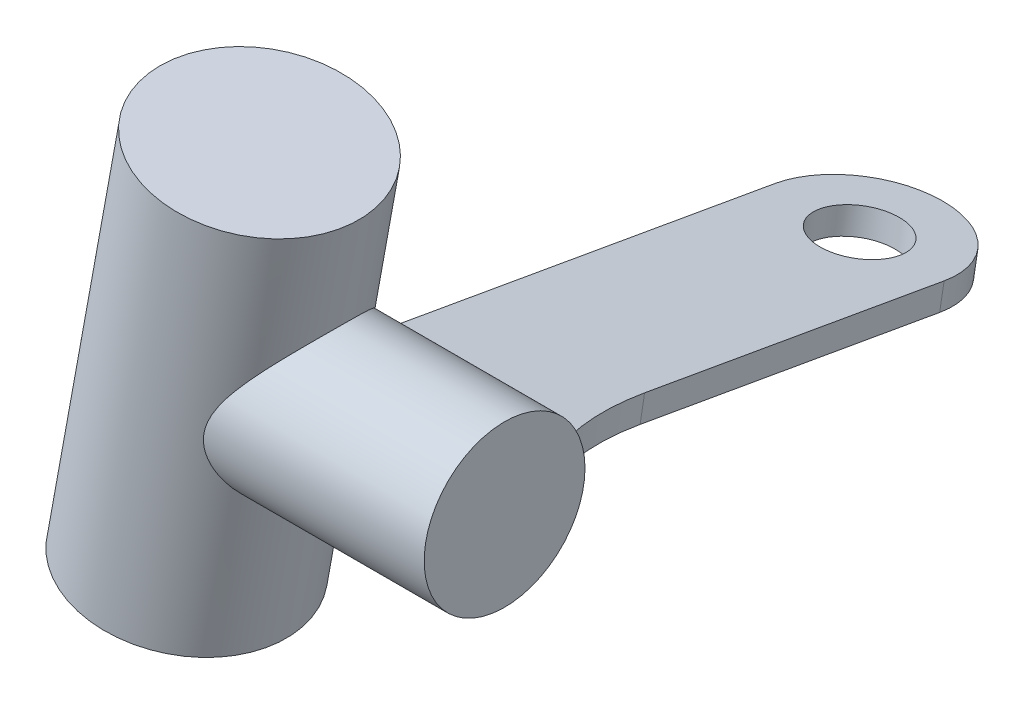
ISO-10303-21;
HEADER;
FILE_DESCRIPTION(('STEP AP214'),'2;1');
FILE_NAME('part.step','',(''),(''),'','','');
FILE_SCHEMA(('AUTOMOTIVE_DESIGN { 1 0 10303 214 1 1 1 1 }'));
ENDSEC;
DATA;
#1=APPLICATION_CONTEXT('core data for automotive mechanical design processes');
#2=APPLICATION_PROTOCOL_DEFINITION('international standard','automotive_design',2000,#1);
#3=PRODUCT_CONTEXT('',#1,'mechanical');
#4=PRODUCT('Part','Part','',(#3));
#5=PRODUCT_RELATED_PRODUCT_CATEGORY('part','',(#4));
#6=PRODUCT_DEFINITION_FORMATION('','',#4);
#7=PRODUCT_DEFINITION_CONTEXT('part definition',#1,'design');
#8=PRODUCT_DEFINITION('design','',#6,#7);
#9=PRODUCT_DEFINITION_SHAPE('','',#8);
#10=(LENGTH_UNIT() NAMED_UNIT(*) SI_UNIT(.MILLI.,.METRE.));
#11=(NAMED_UNIT(*) PLANE_ANGLE_UNIT() SI_UNIT($,.RADIAN.));
#12=(NAMED_UNIT(*) SI_UNIT($,.STERADIAN.) SOLID_ANGLE_UNIT());
#13=UNCERTAINTY_MEASURE_WITH_UNIT(LENGTH_MEASURE(1.E-05),#10,'distance_accuracy_value','');
#14=(GEOMETRIC_REPRESENTATION_CONTEXT(3) GLOBAL_UNCERTAINTY_ASSIGNED_CONTEXT((#13)) GLOBAL_UNIT_ASSIGNED_CONTEXT((#10,
#11,#12)) REPRESENTATION_CONTEXT('',''));
#15=CARTESIAN_POINT('',(0.,0.,0.));
#16=DIRECTION('',(0.,0.,1.));
#17=DIRECTION('',(1.,0.,0.));
#18=AXIS2_PLACEMENT_3D('',#15,#16,#17);
#19=CARTESIAN_POINT('',(-15.,-12.8616465689199,-25.4520253263644));
#20=DIRECTION('',(0.,0.866025403784442,-0.499999999999994));
#21=DIRECTION('',(0.,0.499999999999994,0.866025403784442));
#22=AXIS2_PLACEMENT_3D('',#19,#20,#21);
#23=PLANE('',#22);
#24=CARTESIAN_POINT('',(39.7221129530484,-18.7645988885125,-35.6762386585556));
#25=DIRECTION('',(0.,0.866025403784442,-0.499999999999994));
#26=DIRECTION('',(0.,0.499999999999994,0.866025403784442));
#27=AXIS2_PLACEMENT_3D('',#24,#25,#26);
#28=ELLIPSE('',#27,35.8863230455562,33.7221129530484);
#29=CARTESIAN_POINT('',(8.06525641866222,-12.5817274870452,-24.9671912545494));
#30=VERTEX_POINT('',#29);
#31=CARTESIAN_POINT('',(10.4943666920415,-9.81474755847106,-20.1746414347357));
#32=VERTEX_POINT('',#31);
#33=EDGE_CURVE('E51',#30,#32,#28,.T.);
#34=ORIENTED_EDGE('',*,*,#33,.F.);
#35=DIRECTION('',(1.,0.,0.));
#36=VECTOR('',#35,1.);
#37=CARTESIAN_POINT('',(-15.,-12.5817274870452,-24.9671912545494));
#38=LINE('',#37,#36);
#39=CARTESIAN_POINT('',(-15.,-12.5817274870452,-24.9671912545495));
#40=VERTEX_POINT('',#39);
#41=EDGE_CURVE('E351',#40,#30,#38,.T.);
#42=ORIENTED_EDGE('',*,*,#41,.F.);
#43=DIRECTION('',(0.,0.499999999999994,0.866025403784442));
#44=VECTOR('',#43,1.);
#45=CARTESIAN_POINT('',(-15.,-12.8616465689199,-25.4520253263644));
#46=LINE('',#45,#44);
#47=CARTESIAN_POINT('',(-15.,-4.96881481459879,-11.7812397122871));
#48=VERTEX_POINT('',#47);
#49=EDGE_CURVE('E146',#40,#48,#46,.T.);
#50=ORIENTED_EDGE('',*,*,#49,.T.);
#51=CARTESIAN_POINT('',(-9.67810962203151,1.8254835432095,-0.0131697547811885));
#52=DIRECTION('',(0.,0.866025403784442,-0.499999999999994));
#53=DIRECTION('',(-0.336322043603112,-0.470873518842004,-0.815576858573105));
#54=AXIS2_PLACEMENT_3D('',#51,#52,#53);
#55=ELLIPSE('',#54,14.5960063578834,12.5);
#56=CARTESIAN_POINT('',(-2.21444101385907,-3.56177873394936,-9.34418173252139));
#57=VERTEX_POINT('',#56);
#58=EDGE_CURVE('E144',#57,#48,#55,.T.);
#59=ORIENTED_EDGE('',*,*,#58,.F.);
#60=DIRECTION('',(1.,0.,0.));
#61=VECTOR('',#60,1.);
#62=CARTESIAN_POINT('',(-10.,-3.56177873395016,-9.34418173252106));
#63=LINE('',#62,#61);
#64=CARTESIAN_POINT('',(15.,-3.56177873395016,-9.34418173252107));
#65=VERTEX_POINT('',#64);
#66=EDGE_CURVE('E364',#57,#65,#63,.T.);
#67=ORIENTED_EDGE('',*,*,#66,.T.);
#68=DIRECTION('',(0.,0.499999999999994,0.866025403784442));
#69=VECTOR('',#68,1.);
#70=CARTESIAN_POINT('',(15.,-12.8616465689199,-25.4520253263644));
#71=LINE('',#70,#69);
#72=CARTESIAN_POINT('',(15.,-3.62518467149175,-9.45400403784463));
#73=VERTEX_POINT('',#72);
#74=EDGE_CURVE('E134',#73,#65,#71,.T.);
#75=ORIENTED_EDGE('',*,*,#74,.F.);
#76=DIRECTION('',(0.342020143325663,0.46984631039295,0.813797681349379));
#77=VECTOR('',#76,1.);
#78=CARTESIAN_POINT('',(15.,-3.62518467149175,-9.45400403784463));
#79=LINE('',#78,#77);
#80=EDGE_CURVE('E135',#32,#73,#79,.T.);
#81=ORIENTED_EDGE('',*,*,#80,.F.);
#82=EDGE_LOOP('',(#34,#42,#50,#59,#67,#75,#81));
#83=FACE_BOUND('',#82,.T.);
#84=ADVANCED_FACE('F34',(#83),#23,.T.);
#85=CARTESIAN_POINT('',(15.,0.,0.));
#86=DIRECTION('',(1.,0.,0.));
#87=DIRECTION('',(0.,0.,-1.));
#88=AXIS2_PLACEMENT_3D('',#85,#86,#87);
#89=PLANE('',#88);
#90=DIRECTION('',(0.,-0.866025403784442,0.499999999999994));
#91=VECTOR('',#90,1.);
#92=CARTESIAN_POINT('',(15.,-4.99999999999995,-8.66025403784442));
#93=LINE('',#92,#91);
#94=CARTESIAN_POINT('',(15.,-4.99999999999994,-8.66025403784442));
#95=VERTEX_POINT('',#94);
#96=EDGE_CURVE('E11',#73,#95,#93,.T.);
#97=ORIENTED_EDGE('',*,*,#96,.F.);
#98=ORIENTED_EDGE('',*,*,#74,.T.);
#99=CARTESIAN_POINT('',(15.,0.,0.));
#100=DIRECTION('',(1.,0.,0.));
#101=DIRECTION('',(0.,0.,-1.));
#102=AXIS2_PLACEMENT_3D('',#99,#100,#101);
#103=CIRCLE('',#102,10.);
#104=EDGE_CURVE('E168',#65,#95,#103,.F.);
#105=ORIENTED_EDGE('',*,*,#104,.T.);
#106=EDGE_LOOP('',(#97,#98,#105));
#107=FACE_BOUND('',#106,.T.);
#108=ADVANCED_FACE('F175',(#107),#89,.T.);
#109=CARTESIAN_POINT('',(-5.65879555832661,24.6195531410487,-0.177615119509685));
#110=DIRECTION('',(-0.173648177666927,-0.984782125641946,0.00710460478038752));
#111=DIRECTION('',(0.984806980223185,-0.173652560314242,0.));
#112=AXIS2_PLACEMENT_3D('',#109,#110,#111);
#113=CYLINDRICAL_SURFACE('',#112,12.5);
#114=CARTESIAN_POINT('',(-2.37122751207205,0.,-10.));
#115=CARTESIAN_POINT('',(-2.33186606656457,0.211547890563131,-10.0000021967534));
#116=CARTESIAN_POINT('',(-2.28368754730734,0.421419531292979,-9.99327450323766));
#117=CARTESIAN_POINT('',(-2.17144491383989,0.836140913414193,-9.96714988500936));
#118=CARTESIAN_POINT('',(-2.10737167001065,1.04098769405718,-9.94774566865033));
#119=CARTESIAN_POINT('',(-1.96542419577827,1.44510738333065,-9.89713608826799));
#120=CARTESIAN_POINT('',(-1.88750180419782,1.64435793621536,-9.86588909642186));
#121=CARTESIAN_POINT('',(-1.72048337442154,2.0359977928105,-9.79256917752428));
#122=CARTESIAN_POINT('',(-1.63138715454737,2.22838698489487,-9.75049607443645));
#123=CARTESIAN_POINT('',(-1.39976379415893,2.69627847041153,-9.6339385297028));
#124=CARTESIAN_POINT('',(-1.25199974111008,2.96772270158199,-9.55356127350568));
#125=CARTESIAN_POINT('',(-0.943425698627354,3.49626022907402,-9.37305820149386));
#126=CARTESIAN_POINT('',(-0.78260811966236,3.75334502782919,-9.27292084771806));
#127=CARTESIAN_POINT('',(-0.452640844529678,4.25441363553669,-9.05399382146521));
#128=CARTESIAN_POINT('',(-0.283479203376289,4.49837755240461,-8.93517684301814));
#129=CARTESIAN_POINT('',(0.0590307194257454,4.97353944026718,-8.67966884171438));
#130=CARTESIAN_POINT('',(0.232378177374104,5.20473989394571,-8.54298131249322));
#131=CARTESIAN_POINT('',(0.591245544738462,5.66930349533057,-8.2425920753871));
#132=CARTESIAN_POINT('',(0.776834554894736,5.901858318689,-8.07772142252491));
#133=CARTESIAN_POINT('',(1.14586841508491,6.35315605003508,-7.72780365024937));
#134=CARTESIAN_POINT('',(1.32931294962832,6.57189694607847,-7.54275360243948));
#135=CARTESIAN_POINT('',(1.69064510153078,6.99469553150067,-7.15240100372609));
#136=CARTESIAN_POINT('',(1.86854085530249,7.19877535303141,-6.9471301381845));
#137=CARTESIAN_POINT('',(2.21581781142048,7.59138398738598,-6.51582595045574));
#138=CARTESIAN_POINT('',(2.38520146714816,7.77991729122928,-6.28979866446591));
#139=CARTESIAN_POINT('',(2.80105825472849,8.23764326346652,-5.68782880187569));
#140=CARTESIAN_POINT('',(3.03956963634143,8.49518593570571,-5.2970178078644));
#141=CARTESIAN_POINT('',(3.36567692484083,8.84376127887212,-4.67381613537803));
#142=CARTESIAN_POINT('',(3.46909072496176,8.95365081272702,-4.45994987554715));
#143=CARTESIAN_POINT('',(3.66357804300275,9.15953499925609,-4.02017393038783));
#144=CARTESIAN_POINT('',(3.75465383754625,9.2555322155809,-3.79426647766395));
#145=CARTESIAN_POINT('',(3.90777915691697,9.41659872489991,-3.37186192997674));
#146=CARTESIAN_POINT('',(3.97211925772817,9.48414065367897,-3.17713338429019));
#147=CARTESIAN_POINT('',(4.08994600812166,9.60779247837148,-2.78089391435279));
#148=CARTESIAN_POINT('',(4.14343500064624,9.66390484213673,-2.57938446519498));
#149=CARTESIAN_POINT('',(4.23852515965061,9.76382860701491,-2.17068638331255));
#150=CARTESIAN_POINT('',(4.28013231811281,9.80764620815401,-1.96350067109466));
#151=CARTESIAN_POINT('',(4.35062051658547,9.8822723127342,-1.54464821981776));
#152=CARTESIAN_POINT('',(4.37950146362579,9.91308072113776,-1.33298144803461));
#153=CARTESIAN_POINT('',(4.42398318113285,9.9612297501651,-0.905720013655074));
#154=CARTESIAN_POINT('',(4.43952162824781,9.97850713418682,-0.69011167093636));
#155=CARTESIAN_POINT('',(4.45671591731593,9.99902292678675,-0.257671354289186));
#156=CARTESIAN_POINT('',(4.45837174496848,10.0022613209033,-0.0408393791004808));
#157=CARTESIAN_POINT('',(4.44776032400616,9.99465139663323,0.392239109894308));
#158=CARTESIAN_POINT('',(4.43549259195285,9.98380258912456,0.608485603110611));
#159=CARTESIAN_POINT('',(4.39733012404207,9.94825870487492,1.03861262478124));
#160=CARTESIAN_POINT('',(4.37143571842103,9.9235639636831,1.25249321044405));
#161=CARTESIAN_POINT('',(4.30892217229414,9.86305579815202,1.66125114097922));
#162=CARTESIAN_POINT('',(4.2731922789526,9.82815350115491,1.8564017018136));
#163=CARTESIAN_POINT('',(4.19114692880275,9.74737483347136,2.24221884995754));
#164=CARTESIAN_POINT('',(4.14482752761635,9.70149437334294,2.43288373718437));
#165=CARTESIAN_POINT('',(4.04241120501084,9.59942862119815,2.80871635820001));
#166=CARTESIAN_POINT('',(3.98631505505307,9.54324414223055,2.99388452437456));
#167=CARTESIAN_POINT('',(3.86520840489644,9.42127210101571,3.35805405113932));
#168=CARTESIAN_POINT('',(3.8001960184005,9.35548250654328,3.53705409676386));
#169=CARTESIAN_POINT('',(3.63426494259953,9.18663682171188,3.95932083644448));
#170=CARTESIAN_POINT('',(3.52944939818889,9.07926128904359,4.19934414556875));
#171=CARTESIAN_POINT('',(3.30647746705372,8.84888437954846,4.66528178693352));
#172=CARTESIAN_POINT('',(3.18831658989402,8.72587774141745,4.89119133022619));
#173=CARTESIAN_POINT('',(2.94075898111936,8.46567714086706,5.32890852208008));
#174=CARTESIAN_POINT('',(2.81134012176331,8.32845513209255,5.54068688376459));
#175=CARTESIAN_POINT('',(2.54365888414883,8.04145943474058,5.94956537956503));
#176=CARTESIAN_POINT('',(2.40539644684966,7.89168566236403,6.14666541566776));
#177=CARTESIAN_POINT('',(2.07332870336902,7.52726567410016,6.59158659617227));
#178=CARTESIAN_POINT('',(1.87675657102934,7.30800623447057,6.83357791510917));
#179=CARTESIAN_POINT('',(1.47570717542312,6.85067916165105,7.29198854800531));
#180=CARTESIAN_POINT('',(1.27122645420295,6.61260325256417,7.50839650422796));
#181=CARTESIAN_POINT('',(0.858638678555726,6.11846596482342,7.9162550853694));
#182=CARTESIAN_POINT('',(0.650528913542538,5.86239066798211,8.10768606255246));
#183=CARTESIAN_POINT('',(0.235534034165025,5.33256457654742,8.46557484336424));
#184=CARTESIAN_POINT('',(0.028648474004249,5.05882071159103,8.63204235358637));
#185=CARTESIAN_POINT('',(-0.32025511447809,4.57376915031572,8.89569969113249));
#186=CARTESIAN_POINT('',(-0.463907479872336,4.36698770284174,8.99908880713032));
#187=CARTESIAN_POINT('',(-0.745409765948771,3.94343062551648,9.19258366168271));
#188=CARTESIAN_POINT('',(-0.883259431359649,3.72665455686082,9.2826888162871));
#189=CARTESIAN_POINT('',(-1.14987601134081,3.28298707864525,9.44869993638791));
#190=CARTESIAN_POINT('',(-1.27866273658981,3.05611962088625,9.52463751184776));
#191=CARTESIAN_POINT('',(-1.52376268169412,2.59149947176008,9.66140946313962));
#192=CARTESIAN_POINT('',(-1.64008134546216,2.35375159633317,9.72225044596026));
#193=CARTESIAN_POINT('',(-1.89737850075857,1.77342969450779,9.84750429976642));
#194=CARTESIAN_POINT('',(-2.03072922881497,1.42559401747437,9.90435395104461));
#195=CARTESIAN_POINT('',(-2.19674975318442,0.890811363704197,9.96185802892019));
#196=CARTESIAN_POINT('',(-2.24640283771843,0.710490369163447,9.97639724531068));
#197=CARTESIAN_POINT('',(-2.33310629203206,0.346270819223305,9.99566463607511));
#198=CARTESIAN_POINT('',(-2.3701570086593,0.162372362431615,10.0003930804835));
#199=CARTESIAN_POINT('',(-2.43086337844946,-0.208941744382549,9.99955274444552));
#200=CARTESIAN_POINT('',(-2.4544227581366,-0.396373050189421,9.99391113595739));
#201=CARTESIAN_POINT('',(-2.48738707190154,-0.771850531865798,9.97194105379317));
#202=CARTESIAN_POINT('',(-2.49679228488336,-0.95989669554652,9.95561279070381));
#203=CARTESIAN_POINT('',(-2.50182467301423,-1.33513931918095,9.91227108615452));
#204=CARTESIAN_POINT('',(-2.49743619573934,-1.52233457226841,9.88524553632704));
#205=CARTESIAN_POINT('',(-2.4758772153313,-1.89416968249486,9.82078142709529));
#206=CARTESIAN_POINT('',(-2.45870479930288,-2.0788091529932,9.78334130985637));
#207=CARTESIAN_POINT('',(-2.4085046122391,-2.48064387427573,9.69004495953675));
#208=CARTESIAN_POINT('',(-2.37300543217018,-2.69702284073688,9.63200805660558));
#209=CARTESIAN_POINT('',(-2.28864002985773,-3.1230027525743,9.50244521791399));
#210=CARTESIAN_POINT('',(-2.23977052476672,-3.33260201916306,9.43091597068766));
#211=CARTESIAN_POINT('',(-2.13142796809475,-3.74467110437023,9.27502440664462));
#212=CARTESIAN_POINT('',(-2.07193133743955,-3.94712384512418,9.19063361549666));
#213=CARTESIAN_POINT('',(-1.94503323750642,-4.34399135095342,9.00984464215801));
#214=CARTESIAN_POINT('',(-1.87763127804674,-4.53840561657903,8.91344571536186));
#215=CARTESIAN_POINT('',(-1.71109248770018,-4.98979451834596,8.671202684952));
#216=CARTESIAN_POINT('',(-1.60947467085126,-5.24315101659021,8.5203014560125));
#217=CARTESIAN_POINT('',(-1.40057101248385,-5.73402666989541,8.19799899782456));
#218=CARTESIAN_POINT('',(-1.2932833642121,-5.97154072137944,8.0265912116797));
#219=CARTESIAN_POINT('',(-1.0770050470731,-6.4302725218313,7.66401197234176));
#220=CARTESIAN_POINT('',(-0.968013869292171,-6.65148528362465,7.47283451350389));
#221=CARTESIAN_POINT('',(-0.751738636116376,-7.07675252148927,7.07142506784928));
#222=CARTESIAN_POINT('',(-0.644454393866361,-7.28080888626472,6.86119518377428));
#223=CARTESIAN_POINT('',(-0.433530399479624,-7.67257605127864,6.42023118532409));
#224=CARTESIAN_POINT('',(-0.3299348595788,-7.86011348292645,6.18932152381573));
#225=CARTESIAN_POINT('',(-0.130225328346403,-8.21523380076986,5.70955278040693));
#226=CARTESIAN_POINT('',(-0.0341116643805851,-8.38281581399582,5.46069291402102));
#227=CARTESIAN_POINT('',(0.147980275689365,-8.69617603452572,4.94642184217164));
#228=CARTESIAN_POINT('',(0.233968272499609,-8.84197519026253,4.6810268910981));
#229=CARTESIAN_POINT('',(0.393530215095557,-9.11008936478797,4.13505944147093));
#230=CARTESIAN_POINT('',(0.467105924427729,-9.23240772008624,3.85448910653987));
#231=CARTESIAN_POINT('',(0.594157395947255,-9.44251947498398,3.30426439300656));
#232=CARTESIAN_POINT('',(0.64879850645238,-9.53234285793846,3.03565469703358));
#233=CARTESIAN_POINT('',(0.744420821228715,-9.68932833045953,2.48950201817202));
#234=CARTESIAN_POINT('',(0.78540264279105,-9.75649144409159,2.21195943960039));
#235=CARTESIAN_POINT('',(0.852538712758157,-9.86696986070667,1.65065191573115));
#236=CARTESIAN_POINT('',(0.878706086608928,-9.91030627291294,1.36689271059772));
#237=CARTESIAN_POINT('',(0.915507342333786,-9.97242822950615,0.795714215395379));
#238=CARTESIAN_POINT('',(0.926143485151564,-9.99121734729941,0.508295464207432));
#239=CARTESIAN_POINT('',(0.931183823862741,-10.00298988772,-0.0251480186186683));
#240=CARTESIAN_POINT('',(0.927732150594609,-9.99934196025681,-0.271086460327969));
#241=CARTESIAN_POINT('',(0.909366142182668,-9.97398035531322,-0.761577900740032));
#242=CARTESIAN_POINT('',(0.894453197689782,-9.95226886954445,-1.0061310638991));
#243=CARTESIAN_POINT('',(0.853485256010194,-9.89109634551444,-1.49203965578106));
#244=CARTESIAN_POINT('',(0.827430742967443,-9.85163607850208,-1.73339522298199));
#245=CARTESIAN_POINT('',(0.764722807999863,-9.75550015628062,-2.21124781168161));
#246=CARTESIAN_POINT('',(0.728069068074645,-9.69882398455352,-2.44774468718068));
#247=CARTESIAN_POINT('',(0.645713602808179,-9.57023844202447,-2.90979722538828));
#248=CARTESIAN_POINT('',(0.600203096877929,-9.49864907834889,-3.13547645095274));
#249=CARTESIAN_POINT('',(0.500518223628218,-9.3403501378941,-3.57958933749246));
#250=CARTESIAN_POINT('',(0.446340379644377,-9.25363449235615,-3.79802004829284));
#251=CARTESIAN_POINT('',(0.330299872751209,-9.06596662206447,-4.22645594962455));
#252=CARTESIAN_POINT('',(0.268439772413213,-8.96501914311396,-4.43646391897177));
#253=CARTESIAN_POINT('',(0.138044741929391,-8.74969600787897,-4.8473320246006));
#254=CARTESIAN_POINT('',(0.069509062332841,-8.63531884358017,-5.04819113003829));
#255=CARTESIAN_POINT('',(-0.0809618171774494,-8.3807098382508,-5.46158547616653));
#256=CARTESIAN_POINT('',(-0.163542317309559,-8.23901822910663,-5.67298715853432));
#257=CARTESIAN_POINT('',(-0.333987884274284,-7.94109963547845,-6.0830234696671));
#258=CARTESIAN_POINT('',(-0.42185331457517,-7.78487165085787,-6.28165721837632));
#259=CARTESIAN_POINT('',(-0.601337511217455,-7.45845766924489,-6.6659646299785));
#260=CARTESIAN_POINT('',(-0.692962663569282,-7.28824738638695,-6.8516146602383));
#261=CARTESIAN_POINT('',(-0.877981733561464,-6.93480957028452,-7.20913392615413));
#262=CARTESIAN_POINT('',(-0.971375768589472,-6.75158117088836,-7.38100224323063));
#263=CARTESIAN_POINT('',(-1.17235695436097,-6.34325918758305,-7.736096487849));
#264=CARTESIAN_POINT('',(-1.27990068551568,-6.1160781180272,-7.91695495618767));
#265=CARTESIAN_POINT('',(-1.49102683957713,-5.64553346079412,-8.25909193683406));
#266=CARTESIAN_POINT('',(-1.59460787194507,-5.40216427316459,-8.42036361839661));
#267=CARTESIAN_POINT('',(-1.79316400885699,-4.90014437704894,-8.72205268467073));
#268=CARTESIAN_POINT('',(-1.88815480888308,-4.64152302632854,-8.86250841576338));
#269=CARTESIAN_POINT('',(-2.06425984246359,-4.10911563043895,-9.12154905994106));
#270=CARTESIAN_POINT('',(-2.14538495062301,-3.83534169433897,-9.24015111820905));
#271=CARTESIAN_POINT('',(-2.25931114872677,-3.38404551841053,-9.41177544103064));
#272=CARTESIAN_POINT('',(-2.29857611229383,-3.21096331645707,-9.47225658130746));
#273=CARTESIAN_POINT('',(-2.36791711143913,-2.86008163710103,-9.58403931234864));
#274=CARTESIAN_POINT('',(-2.39799636068404,-2.6822838331895,-9.63534411089199));
#275=CARTESIAN_POINT('',(-2.4472751464134,-2.3230939388944,-9.72818329524268));
#276=CARTESIAN_POINT('',(-2.46650002159509,-2.1417112511892,-9.76974030271203));
#277=CARTESIAN_POINT('',(-2.49270376826194,-1.77610143691013,-9.84277467468136));
#278=CARTESIAN_POINT('',(-2.49968659549417,-1.59187524856875,-9.87425529245515));
#279=CARTESIAN_POINT('',(-2.50037218200797,-1.17265420041852,-9.93381912517501));
#280=CARTESIAN_POINT('',(-2.49005077488307,-0.937183290492416,-9.95877404295726));
#281=CARTESIAN_POINT('',(-2.44711225286526,-0.467133089913396,-9.99186242559362));
#282=CARTESIAN_POINT('',(-2.41449738458498,-0.232553711811852,-9.99999758511818));
#283=CARTESIAN_POINT('',(-2.37122751207205,0.,-10.));
#284=B_SPLINE_CURVE_WITH_KNOTS('',3,(#114,#115,#116,#117,#118,#119,#120,#121,#122,#123,#124,
#125,#126,#127,#128,#129,#130,#131,#132,#133,#134,#135,#136,#137,#138,#139,#140,#141,#142,#143,
#144,#145,#146,#147,#148,#149,#150,#151,#152,#153,#154,#155,#156,#157,#158,#159,#160,#161,#162,
#163,#164,#165,#166,#167,#168,#169,#170,#171,#172,#173,#174,#175,#176,#177,#178,#179,#180,#181,
#182,#183,#184,#185,#186,#187,#188,#189,#190,#191,#192,#193,#194,#195,#196,#197,#198,#199,#200,
#201,#202,#203,#204,#205,#206,#207,#208,#209,#210,#211,#212,#213,#214,#215,#216,#217,#218,#219,
#220,#221,#222,#223,#224,#225,#226,#227,#228,#229,#230,#231,#232,#233,#234,#235,#236,#237,#238,
#239,#240,#241,#242,#243,#244,#245,#246,#247,#248,#249,#250,#251,#252,#253,#254,#255,#256,#257,
#258,#259,#260,#261,#262,#263,#264,#265,#266,#267,#268,#269,#270,#271,#272,#273,#274,#275,#276,
#277,#278,#279,#280,#281,#282,#283),.UNSPECIFIED.,.T.,.F.,(4,2,2,2,2,2,2,2,2,2,2,2,2,2,2,2,2,2,
2,2,2,2,2,2,2,2,2,2,2,2,2,2,2,2,2,2,2,2,2,2,2,2,2,2,2,2,2,2,2,2,2,2,2,2,2,2,2,2,2,2,2,2,2,2,2,2,
2,2,2,2,2,2,2,2,2,2,2,2,2,2,2,2,2,2,4),(0.,0.64522465940845,1.2908207848364,1.93870757482606,
2.5866049003498,3.54308986879376,4.50013499221728,5.45859236516448,6.41686264216371,
7.43645312313064,8.456191762585,9.47435718167892,10.4922274390164,12.0616440848503,
12.8461375120939,13.6304859859339,14.2776217267415,14.9246175906633,15.5712865974939,
16.2179603284266,16.8676385173054,17.5173173754236,18.1670187916626,18.8167044633995,
19.420386222954,20.0242932092041,20.6281525640644,21.2321398675572,22.0800736894566,
22.9282936787992,23.7782202500393,24.6281524960794,25.7699988232718,26.9123501845864,
28.0555948088472,29.1983937439824,30.0144512614338,30.830544641299,31.6447948325373,
32.458688038042,33.5844261972614,34.1466251232386,34.7088085748907,35.2749552892066,
35.8410908476088,36.4078690615616,36.9747321011196,37.6541646834922,38.3337642384973,
39.0148908306551,39.6960596794371,40.630513526065,41.5652669634786,42.5003051997858,
43.4352403649587,44.379042138471,45.3228851843754,46.2658146175826,47.2086099656794,
48.0726829918077,48.9367169634173,49.7999842070978,50.6631257689652,51.4001837822924,
52.1371523789574,52.8740889547597,53.6110476425933,54.3335761395937,55.0563951890921,
55.7789737721241,56.5016335709687,57.3035082977696,58.105438236278,58.9087917565481,
59.7121987775522,60.6401099762923,61.5683438535256,62.4948459303236,63.4206180007946,
63.9826952332271,64.5445755943379,65.1051388076305,65.6655208539089,66.3748851002116,
67.0841778712174),.UNSPECIFIED.);
#285=CARTESIAN_POINT('',(-1.18611900195685,-6.31140939096593,-7.75668173252114));
#286=VERTEX_POINT('',#285);
#287=EDGE_CURVE('E156',#57,#286,#284,.T.);
#288=ORIENTED_EDGE('',*,*,#287,.F.);
#289=ORIENTED_EDGE('',*,*,#58,.T.);
#290=CARTESIAN_POINT('',(-15.,-28.3556711873731,0.204568941518499));
#291=DIRECTION('',(1.,0.,0.));
#292=DIRECTION('',(0.,-0.999973977286243,0.00721420476093617));
#293=AXIS2_PLACEMENT_3D('',#290,#291,#292);
#294=ELLIPSE('',#293,71.9846310392967,12.5);
#295=CARTESIAN_POINT('',(-15.,-8.73809933121101,-11.959832003242));
#296=VERTEX_POINT('',#295);
#297=EDGE_CURVE('E363',#296,#48,#294,.T.);
#298=ORIENTED_EDGE('',*,*,#297,.F.);
#299=CARTESIAN_POINT('',(-10.3218903779679,-1.82548354320865,0.0131697547811884));
#300=DIRECTION('',(0.,-0.866025403784445,0.499999999999988));
#301=DIRECTION('',(-0.336322043603116,-0.470873518841998,-0.815576858573107));
#302=AXIS2_PLACEMENT_3D('',#299,#300,#301);
#303=ELLIPSE('',#302,14.5960063578834,12.5);
#304=EDGE_CURVE('E142',#296,#286,#303,.T.);
#305=ORIENTED_EDGE('',*,*,#304,.T.);
#306=EDGE_LOOP('',(#288,#289,#298,#305));
#307=FACE_BOUND('',#306,.T.);
#308=CARTESIAN_POINT('',(-5.65879555832661,24.6195531410487,-0.177615119509685));
#309=DIRECTION('',(0.173648177666927,0.984782125641946,-0.00710460478038752));
#310=DIRECTION('',(-0.984806980223185,0.173652560314242,0.));
#311=AXIS2_PLACEMENT_3D('',#308,#309,#310);
#312=CIRCLE('',#311,12.5);
#313=CARTESIAN_POINT('',(-17.9688828111164,26.7902101449767,-0.177615119509685));
#314=VERTEX_POINT('',#313);
#315=EDGE_CURVE('E153',#314,#314,#312,.T.);
#316=ORIENTED_EDGE('',*,*,#315,.F.);
#317=EDGE_LOOP('',(#316));
#318=FACE_BOUND('',#317,.T.);
#319=CARTESIAN_POINT('',(-14.341204441673,-24.6195531410486,0.177615119509691));
#320=DIRECTION('',(0.173648177666927,0.984782125641946,-0.00710460478038752));
#321=DIRECTION('',(-0.984806980223185,0.173652560314242,0.));
#322=AXIS2_PLACEMENT_3D('',#319,#320,#321);
#323=CIRCLE('',#322,12.5);
#324=CARTESIAN_POINT('',(-26.6512916944628,-22.4488961371206,0.177615119509691));
#325=VERTEX_POINT('',#324);
#326=EDGE_CURVE('E152',#325,#325,#323,.T.);
#327=ORIENTED_EDGE('',*,*,#326,.T.);
#328=EDGE_LOOP('',(#327));
#329=FACE_BOUND('',#328,.T.);
#330=ADVANCED_FACE('F170',(#307,#318,#329),#113,.T.);
#331=CARTESIAN_POINT('',(-5.65879555832661,24.6195531410487,-0.177615119509685));
#332=DIRECTION('',(0.173648177666927,0.984782125641946,-0.00710460478038752));
#333=DIRECTION('',(-0.984806980223185,0.173652560314242,0.));
#334=AXIS2_PLACEMENT_3D('',#331,#332,#333);
#335=PLANE('',#334);
#336=ORIENTED_EDGE('',*,*,#315,.T.);
#337=EDGE_LOOP('',(#336));
#338=FACE_BOUND('',#337,.T.);
#339=ADVANCED_FACE('F174',(#338),#335,.T.);
#340=CARTESIAN_POINT('',(-14.341204441673,-24.6195531410486,0.177615119509691));
#341=DIRECTION('',(0.173648177666927,0.984782125641946,-0.00710460478038752));
#342=DIRECTION('',(-0.984806980223185,0.173652560314242,0.));
#343=AXIS2_PLACEMENT_3D('',#340,#341,#342);
#344=PLANE('',#343);
#345=ORIENTED_EDGE('',*,*,#326,.F.);
#346=EDGE_LOOP('',(#345));
#347=FACE_BOUND('',#346,.T.);
#348=ADVANCED_FACE('F177',(#347),#344,.F.);
#349=CARTESIAN_POINT('',(-10.,0.,0.));
#350=DIRECTION('',(1.,0.,0.));
#351=DIRECTION('',(0.,0.,-1.));
#352=AXIS2_PLACEMENT_3D('',#349,#350,#351);
#353=CYLINDRICAL_SURFACE('',#352,10.);
#354=ORIENTED_EDGE('',*,*,#66,.F.);
#355=ORIENTED_EDGE('',*,*,#287,.T.);
#356=DIRECTION('',(1.,0.,0.));
#357=VECTOR('',#356,1.);
#358=CARTESIAN_POINT('',(-10.,-6.31140939096593,-7.75668173252113));
#359=LINE('',#358,#357);
#360=CARTESIAN_POINT('',(15.,-6.31140939096593,-7.75668173252113));
#361=VERTEX_POINT('',#360);
#362=EDGE_CURVE('E366',#361,#286,#359,.F.);
#363=ORIENTED_EDGE('',*,*,#362,.F.);
#364=EDGE_CURVE('E162',#95,#361,#103,.F.);
#365=ORIENTED_EDGE('',*,*,#364,.F.);
#366=ORIENTED_EDGE('',*,*,#104,.F.);
#367=EDGE_LOOP('',(#354,#355,#363,#365,#366));
#368=FACE_BOUND('',#367,.T.);
#369=CARTESIAN_POINT('',(25.,0.,0.));
#370=DIRECTION('',(1.,0.,0.));
#371=DIRECTION('',(0.,0.,-1.));
#372=AXIS2_PLACEMENT_3D('',#369,#370,#371);
#373=CIRCLE('',#372,10.);
#374=CARTESIAN_POINT('',(25.,0.,-10.));
#375=VERTEX_POINT('',#374);
#376=EDGE_CURVE('E159',#375,#375,#373,.T.);
#377=ORIENTED_EDGE('',*,*,#376,.F.);
#378=EDGE_LOOP('',(#377));
#379=FACE_BOUND('',#378,.T.);
#380=ADVANCED_FACE('F36',(#368,#379),#353,.T.);
#381=CARTESIAN_POINT('',(25.,0.,0.));
#382=DIRECTION('',(1.,0.,0.));
#383=DIRECTION('',(0.,0.,-1.));
#384=AXIS2_PLACEMENT_3D('',#381,#382,#383);
#385=PLANE('',#384);
#386=ORIENTED_EDGE('',*,*,#376,.T.);
#387=EDGE_LOOP('',(#386));
#388=FACE_BOUND('',#387,.T.);
#389=ADVANCED_FACE('F179',(#388),#385,.T.);
#390=CARTESIAN_POINT('',(-15.,-1.37481532850797,0.79374999999917));
#391=DIRECTION('',(0.,-0.866025403784445,0.499999999999988));
#392=DIRECTION('',(0.,-0.499999999999989,-0.866025403784445));
#393=AXIS2_PLACEMENT_3D('',#390,#391,#392);
#394=PLANE('',#393);
#395=DIRECTION('',(-0.342020143325663,-0.469846310392944,-0.813797681349382));
#396=VECTOR('',#395,1.);
#397=CARTESIAN_POINT('',(14.7046046952172,-6.78061129335931,-8.56936326647446));
#398=LINE('',#397,#396);
#399=CARTESIAN_POINT('',(15.,-6.37481532850745,-7.86650403784459));
#400=VERTEX_POINT('',#399);
#401=CARTESIAN_POINT('',(8.27640559880451,-15.6112772259355,-23.8645253263644));
#402=VERTEX_POINT('',#401);
#403=EDGE_CURVE('E129',#400,#402,#398,.T.);
#404=ORIENTED_EDGE('',*,*,#403,.F.);
#405=DIRECTION('',(0.,-0.499999999999989,-0.866025403784445));
#406=VECTOR('',#405,1.);
#407=CARTESIAN_POINT('',(15.,-1.37481532850797,0.79374999999917));
#408=LINE('',#407,#406);
#409=EDGE_CURVE('E356',#361,#400,#408,.T.);
#410=ORIENTED_EDGE('',*,*,#409,.F.);
#411=ORIENTED_EDGE('',*,*,#362,.T.);
#412=ORIENTED_EDGE('',*,*,#304,.F.);
#413=DIRECTION('',(0.,-0.499999999999989,-0.866025403784445));
#414=VECTOR('',#413,1.);
#415=CARTESIAN_POINT('',(-15.,-1.37481532850797,0.79374999999917));
#416=LINE('',#415,#414);
#417=CARTESIAN_POINT('',(-15.,-15.6112772259355,-23.8645253263644));
#418=VERTEX_POINT('',#417);
#419=EDGE_CURVE('E141',#296,#418,#416,.T.);
#420=ORIENTED_EDGE('',*,*,#419,.T.);
#421=DIRECTION('',(1.,0.,0.));
#422=VECTOR('',#421,1.);
#423=CARTESIAN_POINT('',(-15.,-15.6112772259355,-23.8645253263644));
#424=LINE('',#423,#422);
#425=EDGE_CURVE('E122',#418,#402,#424,.T.);
#426=ORIENTED_EDGE('',*,*,#425,.T.);
#427=EDGE_LOOP('',(#404,#410,#411,#412,#420,#426));
#428=FACE_BOUND('',#427,.T.);
#429=ADVANCED_FACE('F138',(#428),#394,.T.);
#430=CARTESIAN_POINT('',(-15.,0.,0.));
#431=DIRECTION('',(1.,0.,0.));
#432=DIRECTION('',(0.,0.,-1.));
#433=AXIS2_PLACEMENT_3D('',#430,#431,#432);
#434=PLANE('',#433);
#435=ORIENTED_EDGE('',*,*,#49,.F.);
#436=DIRECTION('',(0.,-0.173648177666923,-0.984807753012209));
#437=VECTOR('',#436,1.);
#438=CARTESIAN_POINT('',(-15.,-7.93270081602041,1.39874918375239));
#439=LINE('',#438,#437);
#440=CARTESIAN_POINT('',(-15.,-21.1669214934679,-73.6562459410674));
#441=VERTEX_POINT('',#440);
#442=EDGE_CURVE('E338',#40,#441,#439,.T.);
#443=ORIENTED_EDGE('',*,*,#442,.T.);
#444=DIRECTION('',(0.,-0.984807753012209,0.173648177666923));
#445=VECTOR('',#444,1.);
#446=CARTESIAN_POINT('',(-15.,-21.1669214934679,-73.6562459410674));
#447=LINE('',#446,#445);
#448=CARTESIAN_POINT('',(-15.,-24.2936861092816,-73.1049129769749));
#449=VERTEX_POINT('',#448);
#450=EDGE_CURVE('E339',#441,#449,#447,.T.);
#451=ORIENTED_EDGE('',*,*,#450,.T.);
#452=DIRECTION('',(0.,-0.173648177666923,-0.984807753012209));
#453=VECTOR('',#452,1.);
#454=CARTESIAN_POINT('',(-15.,-11.0594654318342,1.95008214784487));
#455=LINE('',#454,#453);
#456=EDGE_CURVE('E332',#418,#449,#455,.T.);
#457=ORIENTED_EDGE('',*,*,#456,.F.);
#458=ORIENTED_EDGE('',*,*,#419,.F.);
#459=ORIENTED_EDGE('',*,*,#297,.T.);
#460=EDGE_LOOP('',(#435,#443,#451,#457,#458,#459));
#461=FACE_BOUND('',#460,.T.);
#462=ADVANCED_FACE('F186',(#461),#434,.F.);
#463=EDGE_CURVE('E44',#95,#400,#93,.T.);
#464=ORIENTED_EDGE('',*,*,#463,.F.);
#465=ORIENTED_EDGE('',*,*,#364,.T.);
#466=ORIENTED_EDGE('',*,*,#409,.T.);
#467=EDGE_LOOP('',(#464,#465,#466));
#468=FACE_BOUND('',#467,.T.);
#469=ADVANCED_FACE('F197',(#468),#89,.T.);
#470=CARTESIAN_POINT('',(15.,-16.6155657282584,-1.95400403784472));
#471=DIRECTION('',(-0.93969262078591,0.17101007166283,0.29619813272602));
#472=DIRECTION('',(0.300626578483218,0.,0.953741925422949));
#473=AXIS2_PLACEMENT_3D('',#470,#471,#472);
#474=PLANE('',#473);
#475=ORIENTED_EDGE('',*,*,#403,.T.);
#476=CARTESIAN_POINT('',(39.7221129530484,263.997583972137,-85.5348406209066));
#477=DIRECTION('',(-0.93969262078591,0.17101007166283,0.29619813272602));
#478=DIRECTION('',(0.110683046068379,0.971472991129105,-0.209736717862406));
#479=AXIS2_PLACEMENT_3D('',#476,#477,#478);
#480=ELLIPSE('',#479,288.277939644735,33.7221129530484);
#481=EDGE_CURVE('E109',#402,#32,#480,.T.);
#482=ORIENTED_EDGE('',*,*,#481,.T.);
#483=ORIENTED_EDGE('',*,*,#80,.T.);
#484=ORIENTED_EDGE('',*,*,#96,.T.);
#485=ORIENTED_EDGE('',*,*,#463,.T.);
#486=EDGE_LOOP('',(#475,#482,#483,#484,#485));
#487=FACE_BOUND('',#486,.T.);
#488=ADVANCED_FACE('F130',(#487),#474,.F.);
#489=CARTESIAN_POINT('',(39.7221129530484,-14.599518836165,-36.4106546485951));
#490=DIRECTION('',(0.,-0.984807753012209,0.173648177666923));
#491=DIRECTION('',(0.,-0.173648177666923,-0.98480775301221));
#492=AXIS2_PLACEMENT_3D('',#489,#490,#491);
#493=CYLINDRICAL_SURFACE('',#492,33.7221129530484);
#494=CARTESIAN_POINT('',(39.7221129530484,-14.599518836165,-36.4106546485951));
#495=DIRECTION('',(0.,0.984807753012209,-0.173648177666923));
#496=DIRECTION('',(0.,0.173648177666923,0.984807753012209));
#497=AXIS2_PLACEMENT_3D('',#494,#495,#496);
#498=CIRCLE('',#497,33.7221129530484);
#499=CARTESIAN_POINT('',(6.00000000000001,-14.599518836165,-36.4106546485951));
#500=VERTEX_POINT('',#499);
#501=EDGE_CURVE('E329',#30,#500,#498,.F.);
#502=ORIENTED_EDGE('',*,*,#501,.F.);
#503=ORIENTED_EDGE('',*,*,#33,.T.);
#504=ORIENTED_EDGE('',*,*,#481,.F.);
#505=CARTESIAN_POINT('',(39.7221129530484,-17.7262834519788,-35.8593216845026));
#506=DIRECTION('',(0.,0.984807753012209,-0.173648177666923));
#507=DIRECTION('',(0.,0.173648177666923,0.984807753012209));
#508=AXIS2_PLACEMENT_3D('',#505,#506,#507);
#509=CIRCLE('',#508,33.7221129530484);
#510=CARTESIAN_POINT('',(6.00000000000001,-17.7262834519788,-35.8593216845026));
#511=VERTEX_POINT('',#510);
#512=EDGE_CURVE('E113',#402,#511,#509,.F.);
#513=ORIENTED_EDGE('',*,*,#512,.T.);
#514=DIRECTION('',(0.,-0.984807753012209,0.173648177666923));
#515=VECTOR('',#514,1.);
#516=CARTESIAN_POINT('',(6.00000000000001,-14.599518836165,-36.4106546485951));
#517=LINE('',#516,#515);
#518=EDGE_CURVE('E349',#500,#511,#517,.T.);
#519=ORIENTED_EDGE('',*,*,#518,.F.);
#520=EDGE_LOOP('',(#502,#503,#504,#513,#519));
#521=FACE_BOUND('',#520,.T.);
#522=ADVANCED_FACE('F111',(#521),#493,.F.);
#523=CARTESIAN_POINT('',(6.00000000000002,-7.93270081602041,1.39874918375239));
#524=DIRECTION('',(1.,0.,0.));
#525=DIRECTION('',(0.,0.,-1.));
#526=AXIS2_PLACEMENT_3D('',#523,#524,#525);
#527=PLANE('',#526);
#528=DIRECTION('',(0.,0.173648177666923,0.984807753012209));
#529=VECTOR('',#528,1.);
#530=CARTESIAN_POINT('',(6.00000000000002,-11.0594654318342,1.95008214784487));
#531=LINE('',#530,#529);
#532=CARTESIAN_POINT('',(5.99999999999999,-24.2936861092816,-73.1049129769749));
#533=VERTEX_POINT('',#532);
#534=EDGE_CURVE('E126',#533,#511,#531,.T.);
#535=ORIENTED_EDGE('',*,*,#534,.F.);
#536=DIRECTION('',(0.,-0.984807753012209,0.173648177666923));
#537=VECTOR('',#536,1.);
#538=CARTESIAN_POINT('',(5.99999999999999,-21.1669214934678,-73.6562459410674));
#539=LINE('',#538,#537);
#540=CARTESIAN_POINT('',(5.99999999999999,-21.1669214934678,-73.6562459410674));
#541=VERTEX_POINT('',#540);
#542=EDGE_CURVE('E347',#541,#533,#539,.T.);
#543=ORIENTED_EDGE('',*,*,#542,.F.);
#544=DIRECTION('',(0.,0.173648177666923,0.984807753012209));
#545=VECTOR('',#544,1.);
#546=CARTESIAN_POINT('',(6.00000000000002,-7.93270081602041,1.39874918375239));
#547=LINE('',#546,#545);
#548=EDGE_CURVE('E331',#541,#500,#547,.T.);
#549=ORIENTED_EDGE('',*,*,#548,.T.);
#550=ORIENTED_EDGE('',*,*,#518,.T.);
#551=EDGE_LOOP('',(#535,#543,#549,#550));
#552=FACE_BOUND('',#551,.T.);
#553=ADVANCED_FACE('F246',(#552),#527,.T.);
#554=CARTESIAN_POINT('',(-4.5,-21.1669214934678,-73.6562459410674));
#555=DIRECTION('',(0.,-0.984807753012209,0.173648177666923));
#556=DIRECTION('',(0.,-0.173648177666923,-0.98480775301221));
#557=AXIS2_PLACEMENT_3D('',#554,#555,#556);
#558=CYLINDRICAL_SURFACE('',#557,10.5);
#559=CARTESIAN_POINT('',(-4.5,-24.2936861092816,-73.1049129769749));
#560=DIRECTION('',(0.,0.984807753012209,-0.173648177666923));
#561=DIRECTION('',(0.,0.173648177666923,0.984807753012209));
#562=AXIS2_PLACEMENT_3D('',#559,#560,#561);
#563=CIRCLE('',#562,10.5);
#564=EDGE_CURVE('E342',#533,#449,#563,.T.);
#565=ORIENTED_EDGE('',*,*,#564,.T.);
#566=ORIENTED_EDGE('',*,*,#450,.F.);
#567=CARTESIAN_POINT('',(-4.5,-21.1669214934678,-73.6562459410674));
#568=DIRECTION('',(0.,0.984807753012209,-0.173648177666923));
#569=DIRECTION('',(0.,0.173648177666923,0.984807753012209));
#570=AXIS2_PLACEMENT_3D('',#567,#568,#569);
#571=CIRCLE('',#570,10.5);
#572=EDGE_CURVE('E335',#541,#441,#571,.T.);
#573=ORIENTED_EDGE('',*,*,#572,.F.);
#574=ORIENTED_EDGE('',*,*,#542,.T.);
#575=EDGE_LOOP('',(#565,#566,#573,#574));
#576=FACE_BOUND('',#575,.T.);
#577=ADVANCED_FACE('F251',(#576),#558,.T.);
#578=CARTESIAN_POINT('',(0.,-7.93270081602041,1.39874918375239));
#579=DIRECTION('',(0.,0.984807753012209,-0.173648177666923));
#580=DIRECTION('',(0.,0.173648177666923,0.984807753012209));
#581=AXIS2_PLACEMENT_3D('',#578,#579,#580);
#582=PLANE('',#581);
#583=CARTESIAN_POINT('',(-4.5,-21.1669214934679,-73.6562459410674));
#584=DIRECTION('',(0.,0.984807753012209,-0.173648177666923));
#585=DIRECTION('',(0.,0.173648177666923,0.984807753012209));
#586=AXIS2_PLACEMENT_3D('',#583,#584,#585);
#587=CIRCLE('',#586,5.);
#588=CARTESIAN_POINT('',(-4.5,-20.2986806051332,-68.7322071760064));
#589=VERTEX_POINT('',#588);
#590=EDGE_CURVE('E323',#589,#589,#587,.T.);
#591=ORIENTED_EDGE('',*,*,#590,.F.);
#592=EDGE_LOOP('',(#591));
#593=FACE_BOUND('',#592,.T.);
#594=ORIENTED_EDGE('',*,*,#442,.F.);
#595=ORIENTED_EDGE('',*,*,#41,.T.);
#596=ORIENTED_EDGE('',*,*,#501,.T.);
#597=ORIENTED_EDGE('',*,*,#548,.F.);
#598=ORIENTED_EDGE('',*,*,#572,.T.);
#599=EDGE_LOOP('',(#594,#595,#596,#597,#598));
#600=FACE_BOUND('',#599,.T.);
#601=ADVANCED_FACE('F261',(#593,#600),#582,.T.);
#602=CARTESIAN_POINT('',(0.,-11.0594654318342,1.95008214784487));
#603=DIRECTION('',(0.,0.984807753012209,-0.173648177666923));
#604=DIRECTION('',(0.,0.173648177666923,0.984807753012209));
#605=AXIS2_PLACEMENT_3D('',#602,#603,#604);
#606=PLANE('',#605);
#607=CARTESIAN_POINT('',(-4.5,-24.2936861092816,-73.1049129769749));
#608=DIRECTION('',(0.,0.984807753012209,-0.173648177666923));
#609=DIRECTION('',(0.,0.173648177666923,0.984807753012209));
#610=AXIS2_PLACEMENT_3D('',#607,#608,#609);
#611=CIRCLE('',#610,5.);
#612=CARTESIAN_POINT('',(-4.5,-23.425445220947,-68.1808742119139));
#613=VERTEX_POINT('',#612);
#614=EDGE_CURVE('E39',#613,#613,#611,.T.);
#615=ORIENTED_EDGE('',*,*,#614,.T.);
#616=EDGE_LOOP('',(#615));
#617=FACE_BOUND('',#616,.T.);
#618=ORIENTED_EDGE('',*,*,#425,.F.);
#619=ORIENTED_EDGE('',*,*,#456,.T.);
#620=ORIENTED_EDGE('',*,*,#564,.F.);
#621=ORIENTED_EDGE('',*,*,#534,.T.);
#622=ORIENTED_EDGE('',*,*,#512,.F.);
#623=EDGE_LOOP('',(#618,#619,#620,#621,#622));
#624=FACE_BOUND('',#623,.T.);
#625=ADVANCED_FACE('F119',(#617,#624),#606,.F.);
#626=CARTESIAN_POINT('',(-4.5,-31.0149990235899,-71.9197641643982));
#627=DIRECTION('',(0.,0.984807753012209,-0.173648177666923));
#628=DIRECTION('',(0.,0.173648177666923,0.984807753012209));
#629=AXIS2_PLACEMENT_3D('',#626,#627,#628);
#630=CYLINDRICAL_SURFACE('',#629,5.);
#631=ORIENTED_EDGE('',*,*,#590,.T.);
#632=EDGE_LOOP('',(#631));
#633=FACE_BOUND('',#632,.T.);
#634=ORIENTED_EDGE('',*,*,#614,.F.);
#635=EDGE_LOOP('',(#634));
#636=FACE_BOUND('',#635,.T.);
#637=ADVANCED_FACE('F307',(#633,#636),#630,.F.);
#638=CLOSED_SHELL('',(#84,#108,#330,#339,#348,#380,#389,#429,#462,#469,#488,#522,#553,#577,#601,
#625,#637));
#639=MANIFOLD_SOLID_BREP('B2',#638);
#640=ADVANCED_BREP_SHAPE_REPRESENTATION('',(#18,#639),#14);
#641=SHAPE_DEFINITION_REPRESENTATION(#9,#640);
ENDSEC;
END-ISO-10303-21;
